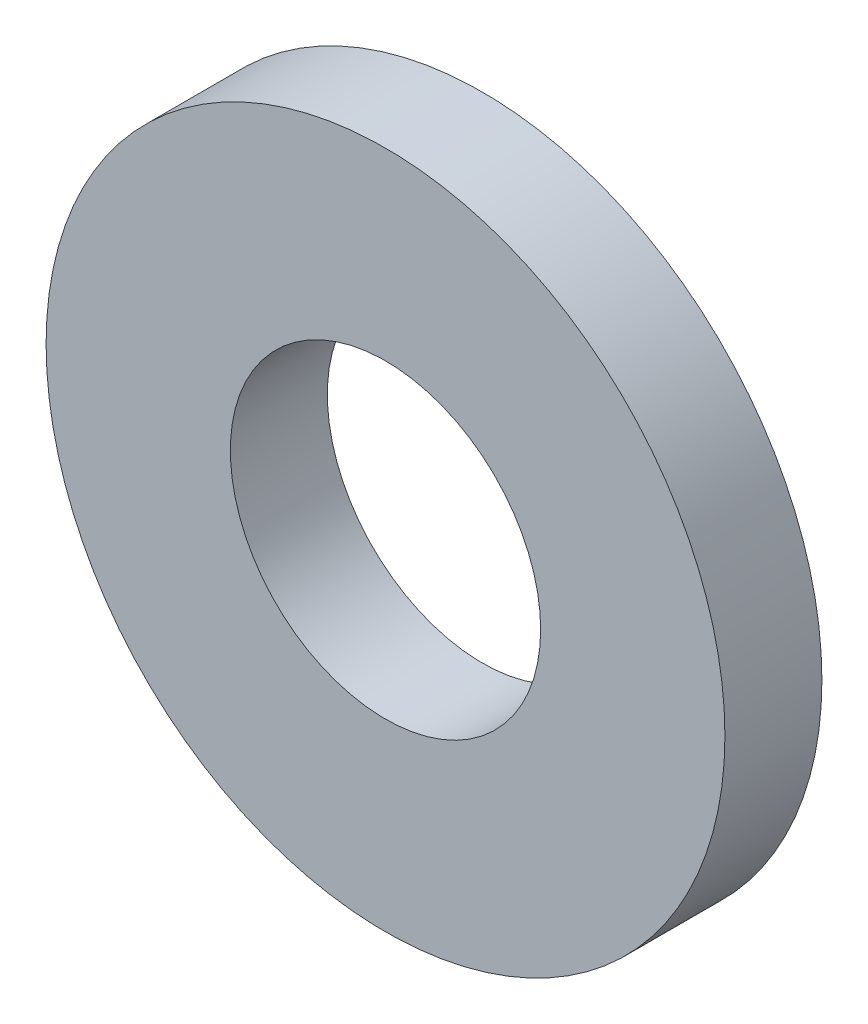
ISO-10303-21;
HEADER;
FILE_DESCRIPTION(('STEP AP214'),'2;1');
FILE_NAME('part.step','',(''),(''),'','','');
FILE_SCHEMA(('AUTOMOTIVE_DESIGN { 1 0 10303 214 1 1 1 1 }'));
ENDSEC;
DATA;
#1=APPLICATION_CONTEXT('core data for automotive mechanical design processes');
#2=APPLICATION_PROTOCOL_DEFINITION('international standard','automotive_design',2000,#1);
#3=PRODUCT_CONTEXT('',#1,'mechanical');
#4=PRODUCT('Part','Part','',(#3));
#5=PRODUCT_RELATED_PRODUCT_CATEGORY('part','',(#4));
#6=PRODUCT_DEFINITION_FORMATION('','',#4);
#7=PRODUCT_DEFINITION_CONTEXT('part definition',#1,'design');
#8=PRODUCT_DEFINITION('design','',#6,#7);
#9=PRODUCT_DEFINITION_SHAPE('','',#8);
#10=(LENGTH_UNIT() NAMED_UNIT(*) SI_UNIT(.MILLI.,.METRE.));
#11=(NAMED_UNIT(*) PLANE_ANGLE_UNIT() SI_UNIT($,.RADIAN.));
#12=(NAMED_UNIT(*) SI_UNIT($,.STERADIAN.) SOLID_ANGLE_UNIT());
#13=UNCERTAINTY_MEASURE_WITH_UNIT(LENGTH_MEASURE(1.E-05),#10,'distance_accuracy_value','');
#14=(GEOMETRIC_REPRESENTATION_CONTEXT(3) GLOBAL_UNCERTAINTY_ASSIGNED_CONTEXT((#13)) GLOBAL_UNIT_ASSIGNED_CONTEXT((#10,
#11,#12)) REPRESENTATION_CONTEXT('',''));
#15=CARTESIAN_POINT('',(0.,0.,0.));
#16=DIRECTION('',(0.,0.,1.));
#17=DIRECTION('',(1.,0.,0.));
#18=AXIS2_PLACEMENT_3D('',#15,#16,#17);
#19=CARTESIAN_POINT('',(0.,0.,1.));
#20=DIRECTION('',(0.,0.,1.));
#21=DIRECTION('',(1.,0.,0.));
#22=AXIS2_PLACEMENT_3D('',#19,#20,#21);
#23=PLANE('',#22);
#24=CARTESIAN_POINT('',(0.,0.,1.));
#25=DIRECTION('',(0.,0.,1.));
#26=DIRECTION('',(1.,0.,0.));
#27=AXIS2_PLACEMENT_3D('',#24,#25,#26);
#28=CIRCLE('',#27,3.5);
#29=CARTESIAN_POINT('',(3.5,0.,1.));
#30=VERTEX_POINT('',#29);
#31=EDGE_CURVE('E10',#30,#30,#28,.T.);
#32=ORIENTED_EDGE('',*,*,#31,.T.);
#33=EDGE_LOOP('',(#32));
#34=FACE_BOUND('',#33,.T.);
#35=CARTESIAN_POINT('',(0.,0.,1.));
#36=DIRECTION('',(0.,0.,1.));
#37=DIRECTION('',(1.,0.,0.));
#38=AXIS2_PLACEMENT_3D('',#35,#36,#37);
#39=CIRCLE('',#38,1.6);
#40=CARTESIAN_POINT('',(1.6,0.,1.));
#41=VERTEX_POINT('',#40);
#42=EDGE_CURVE('E51',#41,#41,#39,.T.);
#43=ORIENTED_EDGE('',*,*,#42,.F.);
#44=EDGE_LOOP('',(#43));
#45=FACE_BOUND('',#44,.T.);
#46=ADVANCED_FACE('F35',(#34,#45),#23,.T.);
#47=CARTESIAN_POINT('',(0.,0.,0.));
#48=DIRECTION('',(0.,0.,1.));
#49=DIRECTION('',(1.,0.,0.));
#50=AXIS2_PLACEMENT_3D('',#47,#48,#49);
#51=PLANE('',#50);
#52=CARTESIAN_POINT('',(0.,0.,0.));
#53=DIRECTION('',(0.,0.,1.));
#54=DIRECTION('',(1.,0.,0.));
#55=AXIS2_PLACEMENT_3D('',#52,#53,#54);
#56=CIRCLE('',#55,3.5);
#57=CARTESIAN_POINT('',(3.5,0.,0.));
#58=VERTEX_POINT('',#57);
#59=EDGE_CURVE('E39',#58,#58,#56,.T.);
#60=ORIENTED_EDGE('',*,*,#59,.F.);
#61=EDGE_LOOP('',(#60));
#62=FACE_BOUND('',#61,.T.);
#63=CARTESIAN_POINT('',(0.,0.,0.));
#64=DIRECTION('',(0.,0.,1.));
#65=DIRECTION('',(1.,0.,0.));
#66=AXIS2_PLACEMENT_3D('',#63,#64,#65);
#67=CIRCLE('',#66,1.6);
#68=CARTESIAN_POINT('',(1.6,0.,0.));
#69=VERTEX_POINT('',#68);
#70=EDGE_CURVE('E53',#69,#69,#67,.T.);
#71=ORIENTED_EDGE('',*,*,#70,.T.);
#72=EDGE_LOOP('',(#71));
#73=FACE_BOUND('',#72,.T.);
#74=ADVANCED_FACE('F63',(#62,#73),#51,.F.);
#75=CARTESIAN_POINT('',(0.,0.,1.));
#76=DIRECTION('',(0.,0.,-1.));
#77=DIRECTION('',(-1.,0.,0.));
#78=AXIS2_PLACEMENT_3D('',#75,#76,#77);
#79=CYLINDRICAL_SURFACE('',#78,3.5);
#80=ORIENTED_EDGE('',*,*,#31,.F.);
#81=EDGE_LOOP('',(#80));
#82=FACE_BOUND('',#81,.T.);
#83=ORIENTED_EDGE('',*,*,#59,.T.);
#84=EDGE_LOOP('',(#83));
#85=FACE_BOUND('',#84,.T.);
#86=ADVANCED_FACE('F37',(#82,#85),#79,.T.);
#87=CARTESIAN_POINT('',(0.,0.,1.));
#88=DIRECTION('',(0.,0.,-1.));
#89=DIRECTION('',(-1.,0.,0.));
#90=AXIS2_PLACEMENT_3D('',#87,#88,#89);
#91=CYLINDRICAL_SURFACE('',#90,1.6);
#92=ORIENTED_EDGE('',*,*,#42,.T.);
#93=EDGE_LOOP('',(#92));
#94=FACE_BOUND('',#93,.T.);
#95=ORIENTED_EDGE('',*,*,#70,.F.);
#96=EDGE_LOOP('',(#95));
#97=FACE_BOUND('',#96,.T.);
#98=ADVANCED_FACE('F59',(#94,#97),#91,.F.);
#99=CLOSED_SHELL('',(#46,#74,#86,#98));
#100=MANIFOLD_SOLID_BREP('B2',#99);
#101=ADVANCED_BREP_SHAPE_REPRESENTATION('',(#18,#100),#14);
#102=SHAPE_DEFINITION_REPRESENTATION(#9,#101);
ENDSEC;
END-ISO-10303-21;
